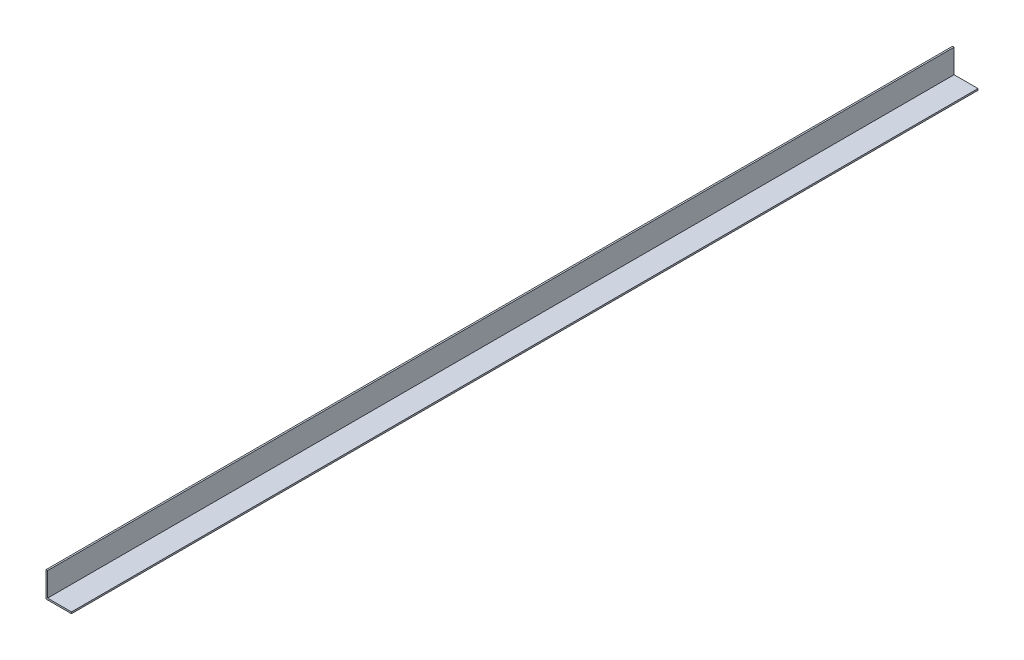
ISO-10303-21;
HEADER;
FILE_DESCRIPTION(('STEP AP214'),'2;1');
FILE_NAME('part.step','',(''),(''),'','','');
FILE_SCHEMA(('AUTOMOTIVE_DESIGN { 1 0 10303 214 1 1 1 1 }'));
ENDSEC;
DATA;
#1=APPLICATION_CONTEXT('core data for automotive mechanical design processes');
#2=APPLICATION_PROTOCOL_DEFINITION('international standard','automotive_design',2000,#1);
#3=PRODUCT_CONTEXT('',#1,'mechanical');
#4=PRODUCT('Part','Part','',(#3));
#5=PRODUCT_RELATED_PRODUCT_CATEGORY('part','',(#4));
#6=PRODUCT_DEFINITION_FORMATION('','',#4);
#7=PRODUCT_DEFINITION_CONTEXT('part definition',#1,'design');
#8=PRODUCT_DEFINITION('design','',#6,#7);
#9=PRODUCT_DEFINITION_SHAPE('','',#8);
#10=(LENGTH_UNIT() NAMED_UNIT(*) SI_UNIT(.MILLI.,.METRE.));
#11=(NAMED_UNIT(*) PLANE_ANGLE_UNIT() SI_UNIT($,.RADIAN.));
#12=(NAMED_UNIT(*) SI_UNIT($,.STERADIAN.) SOLID_ANGLE_UNIT());
#13=UNCERTAINTY_MEASURE_WITH_UNIT(LENGTH_MEASURE(1.E-05),#10,'distance_accuracy_value','');
#14=(GEOMETRIC_REPRESENTATION_CONTEXT(3) GLOBAL_UNCERTAINTY_ASSIGNED_CONTEXT((#13)) GLOBAL_UNIT_ASSIGNED_CONTEXT((#10,
#11,#12)) REPRESENTATION_CONTEXT('',''));
#15=CARTESIAN_POINT('',(0.,0.,0.));
#16=DIRECTION('',(0.,0.,1.));
#17=DIRECTION('',(1.,0.,0.));
#18=AXIS2_PLACEMENT_3D('',#15,#16,#17);
#19=CARTESIAN_POINT('',(50.8,0.,-904.08125));
#20=DIRECTION('',(1.,0.,0.));
#21=DIRECTION('',(0.,0.,-1.));
#22=AXIS2_PLACEMENT_3D('',#19,#20,#21);
#23=PLANE('',#22);
#24=DIRECTION('',(0.,1.,0.));
#25=VECTOR('',#24,1.);
#26=CARTESIAN_POINT('',(50.8,0.,904.08125));
#27=LINE('',#26,#25);
#28=CARTESIAN_POINT('',(50.8,0.,904.08125));
#29=VERTEX_POINT('',#28);
#30=CARTESIAN_POINT('',(50.8,3.175,904.08125));
#31=VERTEX_POINT('',#30);
#32=EDGE_CURVE('E121',#29,#31,#27,.T.);
#33=ORIENTED_EDGE('',*,*,#32,.F.);
#34=DIRECTION('',(0.,0.,-1.));
#35=VECTOR('',#34,1.);
#36=CARTESIAN_POINT('',(50.8,0.,-904.08125));
#37=LINE('',#36,#35);
#38=CARTESIAN_POINT('',(50.8,0.,-904.08125));
#39=VERTEX_POINT('',#38);
#40=EDGE_CURVE('E90',#39,#29,#37,.F.);
#41=ORIENTED_EDGE('',*,*,#40,.F.);
#42=DIRECTION('',(0.,1.,0.));
#43=VECTOR('',#42,1.);
#44=CARTESIAN_POINT('',(50.8,0.,-904.08125));
#45=LINE('',#44,#43);
#46=CARTESIAN_POINT('',(50.8,3.175,-904.08125));
#47=VERTEX_POINT('',#46);
#48=EDGE_CURVE('E87',#39,#47,#45,.T.);
#49=ORIENTED_EDGE('',*,*,#48,.T.);
#50=DIRECTION('',(0.,0.,1.));
#51=VECTOR('',#50,1.);
#52=CARTESIAN_POINT('',(50.8,3.175,-904.08125));
#53=LINE('',#52,#51);
#54=EDGE_CURVE('E36',#31,#47,#53,.F.);
#55=ORIENTED_EDGE('',*,*,#54,.F.);
#56=EDGE_LOOP('',(#33,#41,#49,#55));
#57=FACE_BOUND('',#56,.T.);
#58=ADVANCED_FACE('F33',(#57),#23,.T.);
#59=CARTESIAN_POINT('',(50.8,3.175,-904.08125));
#60=DIRECTION('',(0.,1.,0.));
#61=DIRECTION('',(0.,0.,1.));
#62=AXIS2_PLACEMENT_3D('',#59,#60,#61);
#63=PLANE('',#62);
#64=DIRECTION('',(1.,0.,0.));
#65=VECTOR('',#64,1.);
#66=CARTESIAN_POINT('',(0.,3.175,904.08125));
#67=LINE('',#66,#65);
#68=CARTESIAN_POINT('',(3.175,3.175,904.08125));
#69=VERTEX_POINT('',#68);
#70=EDGE_CURVE('E98',#31,#69,#67,.F.);
#71=ORIENTED_EDGE('',*,*,#70,.F.);
#72=ORIENTED_EDGE('',*,*,#54,.T.);
#73=DIRECTION('',(1.,0.,0.));
#74=VECTOR('',#73,1.);
#75=CARTESIAN_POINT('',(0.,3.175,-904.08125));
#76=LINE('',#75,#74);
#77=CARTESIAN_POINT('',(3.175,3.175,-904.08125));
#78=VERTEX_POINT('',#77);
#79=EDGE_CURVE('E82',#47,#78,#76,.F.);
#80=ORIENTED_EDGE('',*,*,#79,.T.);
#81=DIRECTION('',(0.,0.,-1.));
#82=VECTOR('',#81,1.);
#83=CARTESIAN_POINT('',(3.175,3.175,-904.08125));
#84=LINE('',#83,#82);
#85=EDGE_CURVE('E94',#69,#78,#84,.T.);
#86=ORIENTED_EDGE('',*,*,#85,.F.);
#87=EDGE_LOOP('',(#71,#72,#80,#86));
#88=FACE_BOUND('',#87,.T.);
#89=ADVANCED_FACE('F96',(#88),#63,.T.);
#90=CARTESIAN_POINT('',(3.175,3.175,-904.08125));
#91=DIRECTION('',(1.,0.,0.));
#92=DIRECTION('',(0.,0.,-1.));
#93=AXIS2_PLACEMENT_3D('',#90,#91,#92);
#94=PLANE('',#93);
#95=DIRECTION('',(0.,1.,0.));
#96=VECTOR('',#95,1.);
#97=CARTESIAN_POINT('',(3.175,0.,904.08125));
#98=LINE('',#97,#96);
#99=CARTESIAN_POINT('',(3.175,50.8,904.08125));
#100=VERTEX_POINT('',#99);
#101=EDGE_CURVE('E112',#69,#100,#98,.T.);
#102=ORIENTED_EDGE('',*,*,#101,.F.);
#103=ORIENTED_EDGE('',*,*,#85,.T.);
#104=DIRECTION('',(0.,1.,0.));
#105=VECTOR('',#104,1.);
#106=CARTESIAN_POINT('',(3.175,0.,-904.08125));
#107=LINE('',#106,#105);
#108=CARTESIAN_POINT('',(3.175,50.8,-904.08125));
#109=VERTEX_POINT('',#108);
#110=EDGE_CURVE('E103',#78,#109,#107,.T.);
#111=ORIENTED_EDGE('',*,*,#110,.T.);
#112=DIRECTION('',(0.,0.,1.));
#113=VECTOR('',#112,1.);
#114=CARTESIAN_POINT('',(3.175,50.8,-904.08125));
#115=LINE('',#114,#113);
#116=EDGE_CURVE('E114',#100,#109,#115,.F.);
#117=ORIENTED_EDGE('',*,*,#116,.F.);
#118=EDGE_LOOP('',(#102,#103,#111,#117));
#119=FACE_BOUND('',#118,.T.);
#120=ADVANCED_FACE('F110',(#119),#94,.T.);
#121=CARTESIAN_POINT('',(0.,0.,-904.08125));
#122=DIRECTION('',(0.,0.,1.));
#123=DIRECTION('',(1.,0.,0.));
#124=AXIS2_PLACEMENT_3D('',#121,#122,#123);
#125=PLANE('',#124);
#126=ORIENTED_EDGE('',*,*,#110,.F.);
#127=ORIENTED_EDGE('',*,*,#79,.F.);
#128=ORIENTED_EDGE('',*,*,#48,.F.);
#129=DIRECTION('',(1.,0.,0.));
#130=VECTOR('',#129,1.);
#131=CARTESIAN_POINT('',(0.,0.,-904.08125));
#132=LINE('',#131,#130);
#133=CARTESIAN_POINT('',(0.,0.,-904.08125));
#134=VERTEX_POINT('',#133);
#135=EDGE_CURVE('E105',#134,#39,#132,.T.);
#136=ORIENTED_EDGE('',*,*,#135,.F.);
#137=DIRECTION('',(0.,1.,0.));
#138=VECTOR('',#137,1.);
#139=CARTESIAN_POINT('',(0.,50.8,-904.08125));
#140=LINE('',#139,#138);
#141=CARTESIAN_POINT('',(0.,50.8,-904.08125));
#142=VERTEX_POINT('',#141);
#143=EDGE_CURVE('E132',#142,#134,#140,.F.);
#144=ORIENTED_EDGE('',*,*,#143,.F.);
#145=DIRECTION('',(1.,0.,0.));
#146=VECTOR('',#145,1.);
#147=CARTESIAN_POINT('',(3.175,50.8,-904.08125));
#148=LINE('',#147,#146);
#149=EDGE_CURVE('E117',#109,#142,#148,.F.);
#150=ORIENTED_EDGE('',*,*,#149,.F.);
#151=EDGE_LOOP('',(#126,#127,#128,#136,#144,#150));
#152=FACE_BOUND('',#151,.T.);
#153=ADVANCED_FACE('F101',(#152),#125,.F.);
#154=CARTESIAN_POINT('',(0.,0.,-904.08125));
#155=DIRECTION('',(0.,-1.,0.));
#156=DIRECTION('',(0.,0.,-1.));
#157=AXIS2_PLACEMENT_3D('',#154,#155,#156);
#158=PLANE('',#157);
#159=DIRECTION('',(1.,0.,0.));
#160=VECTOR('',#159,1.);
#161=CARTESIAN_POINT('',(0.,0.,904.08125));
#162=LINE('',#161,#160);
#163=CARTESIAN_POINT('',(0.,0.,904.08125));
#164=VERTEX_POINT('',#163);
#165=EDGE_CURVE('E123',#164,#29,#162,.T.);
#166=ORIENTED_EDGE('',*,*,#165,.F.);
#167=DIRECTION('',(0.,0.,1.));
#168=VECTOR('',#167,1.);
#169=CARTESIAN_POINT('',(0.,0.,-904.08125));
#170=LINE('',#169,#168);
#171=EDGE_CURVE('E131',#134,#164,#170,.T.);
#172=ORIENTED_EDGE('',*,*,#171,.F.);
#173=ORIENTED_EDGE('',*,*,#135,.T.);
#174=ORIENTED_EDGE('',*,*,#40,.T.);
#175=EDGE_LOOP('',(#166,#172,#173,#174));
#176=FACE_BOUND('',#175,.T.);
#177=ADVANCED_FACE('F130',(#176),#158,.T.);
#178=CARTESIAN_POINT('',(0.,0.,904.08125));
#179=DIRECTION('',(0.,0.,1.));
#180=DIRECTION('',(1.,0.,0.));
#181=AXIS2_PLACEMENT_3D('',#178,#179,#180);
#182=PLANE('',#181);
#183=DIRECTION('',(1.,0.,0.));
#184=VECTOR('',#183,1.);
#185=CARTESIAN_POINT('',(3.175,50.8,904.08125));
#186=LINE('',#185,#184);
#187=CARTESIAN_POINT('',(0.,50.8,904.08125));
#188=VERTEX_POINT('',#187);
#189=EDGE_CURVE('E138',#188,#100,#186,.T.);
#190=ORIENTED_EDGE('',*,*,#189,.F.);
#191=DIRECTION('',(0.,1.,0.));
#192=VECTOR('',#191,1.);
#193=CARTESIAN_POINT('',(0.,50.8,904.08125));
#194=LINE('',#193,#192);
#195=EDGE_CURVE('E42',#164,#188,#194,.T.);
#196=ORIENTED_EDGE('',*,*,#195,.F.);
#197=ORIENTED_EDGE('',*,*,#165,.T.);
#198=ORIENTED_EDGE('',*,*,#32,.T.);
#199=ORIENTED_EDGE('',*,*,#70,.T.);
#200=ORIENTED_EDGE('',*,*,#101,.T.);
#201=EDGE_LOOP('',(#190,#196,#197,#198,#199,#200));
#202=FACE_BOUND('',#201,.T.);
#203=ADVANCED_FACE('F119',(#202),#182,.T.);
#204=CARTESIAN_POINT('',(3.175,50.8,-904.08125));
#205=DIRECTION('',(0.,1.,0.));
#206=DIRECTION('',(0.,0.,1.));
#207=AXIS2_PLACEMENT_3D('',#204,#205,#206);
#208=PLANE('',#207);
#209=ORIENTED_EDGE('',*,*,#189,.T.);
#210=ORIENTED_EDGE('',*,*,#116,.T.);
#211=ORIENTED_EDGE('',*,*,#149,.T.);
#212=DIRECTION('',(0.,0.,1.));
#213=VECTOR('',#212,1.);
#214=CARTESIAN_POINT('',(0.,50.8,-904.08125));
#215=LINE('',#214,#213);
#216=EDGE_CURVE('E11',#188,#142,#215,.F.);
#217=ORIENTED_EDGE('',*,*,#216,.F.);
#218=EDGE_LOOP('',(#209,#210,#211,#217));
#219=FACE_BOUND('',#218,.T.);
#220=ADVANCED_FACE('F137',(#219),#208,.T.);
#221=CARTESIAN_POINT('',(0.,50.8,-904.08125));
#222=DIRECTION('',(-1.,0.,0.));
#223=DIRECTION('',(0.,0.,1.));
#224=AXIS2_PLACEMENT_3D('',#221,#222,#223);
#225=PLANE('',#224);
#226=ORIENTED_EDGE('',*,*,#143,.T.);
#227=ORIENTED_EDGE('',*,*,#171,.T.);
#228=ORIENTED_EDGE('',*,*,#195,.T.);
#229=ORIENTED_EDGE('',*,*,#216,.T.);
#230=EDGE_LOOP('',(#226,#227,#228,#229));
#231=FACE_BOUND('',#230,.T.);
#232=ADVANCED_FACE('F139',(#231),#225,.T.);
#233=CLOSED_SHELL('',(#58,#89,#120,#153,#177,#203,#220,#232));
#234=MANIFOLD_SOLID_BREP('B2',#233);
#235=ADVANCED_BREP_SHAPE_REPRESENTATION('',(#18,#234),#14);
#236=SHAPE_DEFINITION_REPRESENTATION(#9,#235);
ENDSEC;
END-ISO-10303-21;
